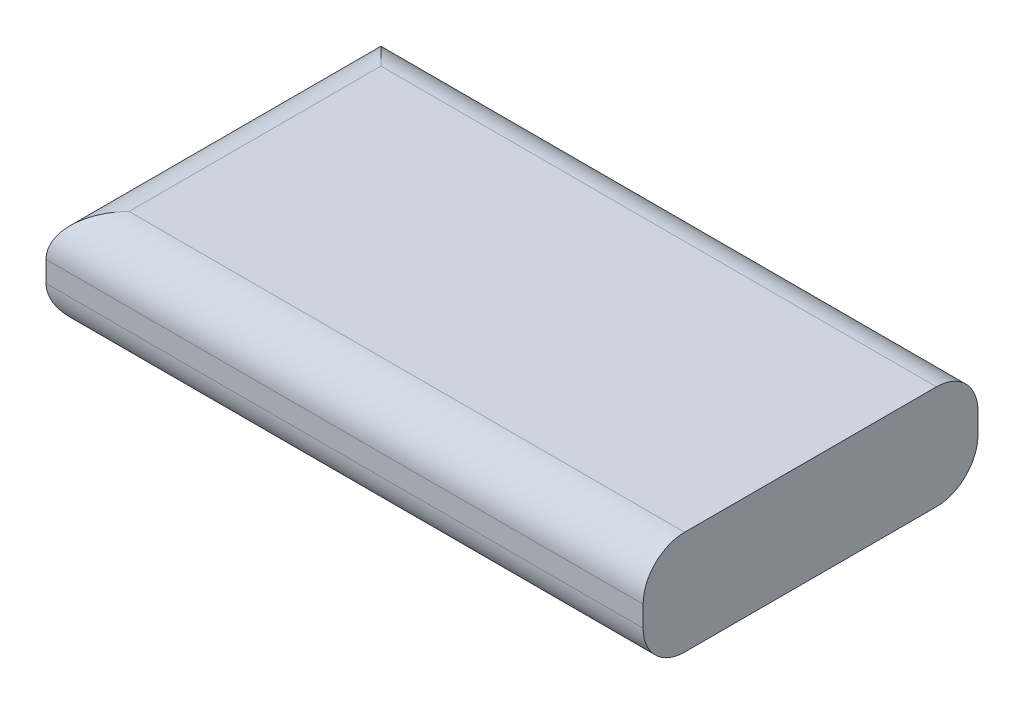
ISO-10303-21;
HEADER;
FILE_DESCRIPTION(('STEP AP214'),'2;1');
FILE_NAME('part.step','',(''),(''),'','','');
FILE_SCHEMA(('AUTOMOTIVE_DESIGN { 1 0 10303 214 1 1 1 1 }'));
ENDSEC;
DATA;
#1=APPLICATION_CONTEXT('core data for automotive mechanical design processes');
#2=APPLICATION_PROTOCOL_DEFINITION('international standard','automotive_design',2000,#1);
#3=PRODUCT_CONTEXT('',#1,'mechanical');
#4=PRODUCT('Part','Part','',(#3));
#5=PRODUCT_RELATED_PRODUCT_CATEGORY('part','',(#4));
#6=PRODUCT_DEFINITION_FORMATION('','',#4);
#7=PRODUCT_DEFINITION_CONTEXT('part definition',#1,'design');
#8=PRODUCT_DEFINITION('design','',#6,#7);
#9=PRODUCT_DEFINITION_SHAPE('','',#8);
#10=(LENGTH_UNIT() NAMED_UNIT(*) SI_UNIT(.MILLI.,.METRE.));
#11=(NAMED_UNIT(*) PLANE_ANGLE_UNIT() SI_UNIT($,.RADIAN.));
#12=(NAMED_UNIT(*) SI_UNIT($,.STERADIAN.) SOLID_ANGLE_UNIT());
#13=UNCERTAINTY_MEASURE_WITH_UNIT(LENGTH_MEASURE(1.E-05),#10,'distance_accuracy_value','');
#14=(GEOMETRIC_REPRESENTATION_CONTEXT(3) GLOBAL_UNCERTAINTY_ASSIGNED_CONTEXT((#13)) GLOBAL_UNIT_ASSIGNED_CONTEXT((#10,
#11,#12)) REPRESENTATION_CONTEXT('',''));
#15=CARTESIAN_POINT('',(0.,0.,0.));
#16=DIRECTION('',(0.,0.,1.));
#17=DIRECTION('',(1.,0.,0.));
#18=AXIS2_PLACEMENT_3D('',#15,#16,#17);
#19=CARTESIAN_POINT('',(-23.,8.,-12.9));
#20=DIRECTION('',(1.,0.,0.));
#21=DIRECTION('',(0.,0.,-1.));
#22=AXIS2_PLACEMENT_3D('',#19,#20,#21);
#23=PLANE('',#22);
#24=DIRECTION('',(0.,-1.,0.));
#25=VECTOR('',#24,1.);
#26=CARTESIAN_POINT('',(-23.,8.,-12.9));
#27=LINE('',#26,#25);
#28=CARTESIAN_POINT('',(-23.,4.8,-12.9));
#29=VERTEX_POINT('',#28);
#30=CARTESIAN_POINT('',(-23.,3.2,-12.9));
#31=VERTEX_POINT('',#30);
#32=EDGE_CURVE('E188',#29,#31,#27,.T.);
#33=ORIENTED_EDGE('',*,*,#32,.T.);
#34=DIRECTION('',(0.,0.,1.));
#35=VECTOR('',#34,1.);
#36=CARTESIAN_POINT('',(-23.,3.2,-12.9));
#37=LINE('',#36,#35);
#38=CARTESIAN_POINT('',(-23.,3.2,12.9));
#39=VERTEX_POINT('',#38);
#40=EDGE_CURVE('E121',#31,#39,#37,.T.);
#41=ORIENTED_EDGE('',*,*,#40,.T.);
#42=DIRECTION('',(0.,-1.,0.));
#43=VECTOR('',#42,1.);
#44=CARTESIAN_POINT('',(-23.,8.,12.9));
#45=LINE('',#44,#43);
#46=CARTESIAN_POINT('',(-23.,4.8,12.9));
#47=VERTEX_POINT('',#46);
#48=EDGE_CURVE('E107',#47,#39,#45,.T.);
#49=ORIENTED_EDGE('',*,*,#48,.F.);
#50=DIRECTION('',(0.,0.,1.));
#51=VECTOR('',#50,1.);
#52=CARTESIAN_POINT('',(-23.,4.8,-12.9));
#53=LINE('',#52,#51);
#54=EDGE_CURVE('E118',#47,#29,#53,.F.);
#55=ORIENTED_EDGE('',*,*,#54,.T.);
#56=EDGE_LOOP('',(#33,#41,#49,#55));
#57=FACE_BOUND('',#56,.T.);
#58=ADVANCED_FACE('F39',(#57),#23,.F.);
#59=CARTESIAN_POINT('',(-23.,8.,12.9));
#60=DIRECTION('',(0.,0.,-1.));
#61=DIRECTION('',(-1.,0.,0.));
#62=AXIS2_PLACEMENT_3D('',#59,#60,#61);
#63=PLANE('',#62);
#64=ORIENTED_EDGE('',*,*,#48,.T.);
#65=DIRECTION('',(1.,0.,0.));
#66=VECTOR('',#65,1.);
#67=CARTESIAN_POINT('',(-23.,3.2,12.9));
#68=LINE('',#67,#66);
#69=CARTESIAN_POINT('',(23.,3.2,12.9));
#70=VERTEX_POINT('',#69);
#71=EDGE_CURVE('E11',#39,#70,#68,.T.);
#72=ORIENTED_EDGE('',*,*,#71,.T.);
#73=DIRECTION('',(0.,-1.,0.));
#74=VECTOR('',#73,1.);
#75=CARTESIAN_POINT('',(23.,8.,12.9));
#76=LINE('',#75,#74);
#77=CARTESIAN_POINT('',(23.,4.8,12.9));
#78=VERTEX_POINT('',#77);
#79=EDGE_CURVE('E108',#78,#70,#76,.T.);
#80=ORIENTED_EDGE('',*,*,#79,.F.);
#81=DIRECTION('',(1.,0.,0.));
#82=VECTOR('',#81,1.);
#83=CARTESIAN_POINT('',(-23.,4.8,12.9));
#84=LINE('',#83,#82);
#85=EDGE_CURVE('E49',#78,#47,#84,.F.);
#86=ORIENTED_EDGE('',*,*,#85,.T.);
#87=EDGE_LOOP('',(#64,#72,#80,#86));
#88=FACE_BOUND('',#87,.T.);
#89=ADVANCED_FACE('F106',(#88),#63,.F.);
#90=CARTESIAN_POINT('',(23.,8.,-12.9));
#91=DIRECTION('',(1.,0.,0.));
#92=DIRECTION('',(0.,0.,-1.));
#93=AXIS2_PLACEMENT_3D('',#90,#91,#92);
#94=PLANE('',#93);
#95=DIRECTION('',(0.,0.,1.));
#96=VECTOR('',#95,1.);
#97=CARTESIAN_POINT('',(23.,0.,-12.9));
#98=LINE('',#97,#96);
#99=CARTESIAN_POINT('',(23.,0.,-9.7));
#100=VERTEX_POINT('',#99);
#101=CARTESIAN_POINT('',(23.,0.,9.7));
#102=VERTEX_POINT('',#101);
#103=EDGE_CURVE('E144',#100,#102,#98,.T.);
#104=ORIENTED_EDGE('',*,*,#103,.F.);
#105=CARTESIAN_POINT('',(23.,3.2,-9.7));
#106=DIRECTION('',(1.,0.,0.));
#107=DIRECTION('',(0.,0.,-1.));
#108=AXIS2_PLACEMENT_3D('',#105,#106,#107);
#109=CIRCLE('',#108,3.2);
#110=CARTESIAN_POINT('',(23.,3.2,-12.9));
#111=VERTEX_POINT('',#110);
#112=EDGE_CURVE('E152',#100,#111,#109,.T.);
#113=ORIENTED_EDGE('',*,*,#112,.T.);
#114=DIRECTION('',(0.,-1.,0.));
#115=VECTOR('',#114,1.);
#116=CARTESIAN_POINT('',(23.,8.,-12.9));
#117=LINE('',#116,#115);
#118=CARTESIAN_POINT('',(23.,4.8,-12.9));
#119=VERTEX_POINT('',#118);
#120=EDGE_CURVE('E184',#119,#111,#117,.T.);
#121=ORIENTED_EDGE('',*,*,#120,.F.);
#122=CARTESIAN_POINT('',(23.,4.8,-9.7));
#123=DIRECTION('',(1.,0.,0.));
#124=DIRECTION('',(0.,0.,-1.));
#125=AXIS2_PLACEMENT_3D('',#122,#123,#124);
#126=CIRCLE('',#125,3.2);
#127=CARTESIAN_POINT('',(23.,8.,-9.7));
#128=VERTEX_POINT('',#127);
#129=EDGE_CURVE('E155',#119,#128,#126,.T.);
#130=ORIENTED_EDGE('',*,*,#129,.T.);
#131=DIRECTION('',(0.,0.,1.));
#132=VECTOR('',#131,1.);
#133=CARTESIAN_POINT('',(23.,8.,-12.9));
#134=LINE('',#133,#132);
#135=CARTESIAN_POINT('',(23.,8.,9.7));
#136=VERTEX_POINT('',#135);
#137=EDGE_CURVE('E191',#128,#136,#134,.T.);
#138=ORIENTED_EDGE('',*,*,#137,.T.);
#139=CARTESIAN_POINT('',(23.,4.8,9.7));
#140=DIRECTION('',(1.,0.,0.));
#141=DIRECTION('',(0.,0.,-1.));
#142=AXIS2_PLACEMENT_3D('',#139,#140,#141);
#143=CIRCLE('',#142,3.2);
#144=EDGE_CURVE('E62',#136,#78,#143,.T.);
#145=ORIENTED_EDGE('',*,*,#144,.T.);
#146=ORIENTED_EDGE('',*,*,#79,.T.);
#147=CARTESIAN_POINT('',(23.,3.2,9.7));
#148=DIRECTION('',(1.,0.,0.));
#149=DIRECTION('',(0.,0.,-1.));
#150=AXIS2_PLACEMENT_3D('',#147,#148,#149);
#151=CIRCLE('',#150,3.2);
#152=EDGE_CURVE('E158',#70,#102,#151,.T.);
#153=ORIENTED_EDGE('',*,*,#152,.T.);
#154=EDGE_LOOP('',(#104,#113,#121,#130,#138,#145,#146,#153));
#155=FACE_BOUND('',#154,.T.);
#156=ADVANCED_FACE('F198',(#155),#94,.T.);
#157=CARTESIAN_POINT('',(-23.,8.,-12.9));
#158=DIRECTION('',(0.,0.,-1.));
#159=DIRECTION('',(-1.,0.,0.));
#160=AXIS2_PLACEMENT_3D('',#157,#158,#159);
#161=PLANE('',#160);
#162=ORIENTED_EDGE('',*,*,#120,.T.);
#163=DIRECTION('',(1.,0.,0.));
#164=VECTOR('',#163,1.);
#165=CARTESIAN_POINT('',(-23.,3.2,-12.9));
#166=LINE('',#165,#164);
#167=EDGE_CURVE('E112',#111,#31,#166,.F.);
#168=ORIENTED_EDGE('',*,*,#167,.T.);
#169=ORIENTED_EDGE('',*,*,#32,.F.);
#170=DIRECTION('',(1.,0.,0.));
#171=VECTOR('',#170,1.);
#172=CARTESIAN_POINT('',(-23.,4.8,-12.9));
#173=LINE('',#172,#171);
#174=EDGE_CURVE('E149',#29,#119,#173,.T.);
#175=ORIENTED_EDGE('',*,*,#174,.T.);
#176=EDGE_LOOP('',(#162,#168,#169,#175));
#177=FACE_BOUND('',#176,.T.);
#178=ADVANCED_FACE('F207',(#177),#161,.T.);
#179=CARTESIAN_POINT('',(0.,8.,0.));
#180=DIRECTION('',(0.,1.,0.));
#181=DIRECTION('',(0.,0.,1.));
#182=AXIS2_PLACEMENT_3D('',#179,#180,#181);
#183=PLANE('',#182);
#184=ORIENTED_EDGE('',*,*,#137,.F.);
#185=DIRECTION('',(1.,0.,0.));
#186=VECTOR('',#185,1.);
#187=CARTESIAN_POINT('',(0.,8.,-9.7));
#188=LINE('',#187,#186);
#189=CARTESIAN_POINT('',(-19.8,8.,-9.7));
#190=VERTEX_POINT('',#189);
#191=EDGE_CURVE('E163',#128,#190,#188,.F.);
#192=ORIENTED_EDGE('',*,*,#191,.T.);
#193=DIRECTION('',(0.,0.,1.));
#194=VECTOR('',#193,1.);
#195=CARTESIAN_POINT('',(-19.8,8.,12.9));
#196=LINE('',#195,#194);
#197=CARTESIAN_POINT('',(-19.8,8.,9.7));
#198=VERTEX_POINT('',#197);
#199=EDGE_CURVE('E166',#190,#198,#196,.T.);
#200=ORIENTED_EDGE('',*,*,#199,.T.);
#201=DIRECTION('',(1.,0.,0.));
#202=VECTOR('',#201,1.);
#203=CARTESIAN_POINT('',(23.,8.,9.7));
#204=LINE('',#203,#202);
#205=EDGE_CURVE('E134',#198,#136,#204,.T.);
#206=ORIENTED_EDGE('',*,*,#205,.T.);
#207=EDGE_LOOP('',(#184,#192,#200,#206));
#208=FACE_BOUND('',#207,.T.);
#209=ADVANCED_FACE('F203',(#208),#183,.T.);
#210=CARTESIAN_POINT('',(0.,0.,0.));
#211=DIRECTION('',(0.,1.,0.));
#212=DIRECTION('',(0.,0.,1.));
#213=AXIS2_PLACEMENT_3D('',#210,#211,#212);
#214=PLANE('',#213);
#215=DIRECTION('',(0.,0.,1.));
#216=VECTOR('',#215,1.);
#217=CARTESIAN_POINT('',(-19.8,0.,0.));
#218=LINE('',#217,#216);
#219=CARTESIAN_POINT('',(-19.8,0.,9.7));
#220=VERTEX_POINT('',#219);
#221=CARTESIAN_POINT('',(-19.8,0.,-9.7));
#222=VERTEX_POINT('',#221);
#223=EDGE_CURVE('E174',#220,#222,#218,.F.);
#224=ORIENTED_EDGE('',*,*,#223,.T.);
#225=DIRECTION('',(1.,0.,0.));
#226=VECTOR('',#225,1.);
#227=CARTESIAN_POINT('',(23.,0.,-9.7));
#228=LINE('',#227,#226);
#229=EDGE_CURVE('E171',#222,#100,#228,.T.);
#230=ORIENTED_EDGE('',*,*,#229,.T.);
#231=ORIENTED_EDGE('',*,*,#103,.T.);
#232=DIRECTION('',(1.,0.,0.));
#233=VECTOR('',#232,1.);
#234=CARTESIAN_POINT('',(0.,0.,9.7));
#235=LINE('',#234,#233);
#236=EDGE_CURVE('E177',#102,#220,#235,.F.);
#237=ORIENTED_EDGE('',*,*,#236,.T.);
#238=EDGE_LOOP('',(#224,#230,#231,#237));
#239=FACE_BOUND('',#238,.T.);
#240=ADVANCED_FACE('F223',(#239),#214,.F.);
#241=CARTESIAN_POINT('',(0.,3.2,-9.7));
#242=DIRECTION('',(-1.,0.,0.));
#243=DIRECTION('',(0.,0.,1.));
#244=AXIS2_PLACEMENT_3D('',#241,#242,#243);
#245=CYLINDRICAL_SURFACE('',#244,3.2);
#246=ORIENTED_EDGE('',*,*,#112,.F.);
#247=ORIENTED_EDGE('',*,*,#229,.F.);
#248=CARTESIAN_POINT('',(-19.8,3.2,-9.7));
#249=DIRECTION('',(-0.707106781186547,0.,0.707106781186547));
#250=DIRECTION('',(-0.707106781186547,0.,-0.707106781186547));
#251=AXIS2_PLACEMENT_3D('',#248,#249,#250);
#252=ELLIPSE('',#251,4.5254833995939,3.2);
#253=EDGE_CURVE('E140',#31,#222,#252,.T.);
#254=ORIENTED_EDGE('',*,*,#253,.F.);
#255=ORIENTED_EDGE('',*,*,#167,.F.);
#256=EDGE_LOOP('',(#246,#247,#254,#255));
#257=FACE_BOUND('',#256,.T.);
#258=ADVANCED_FACE('F212',(#257),#245,.T.);
#259=CARTESIAN_POINT('',(-23.,3.2,9.7));
#260=DIRECTION('',(1.,0.,0.));
#261=DIRECTION('',(0.,0.,-1.));
#262=AXIS2_PLACEMENT_3D('',#259,#260,#261);
#263=CYLINDRICAL_SURFACE('',#262,3.2);
#264=ORIENTED_EDGE('',*,*,#152,.F.);
#265=ORIENTED_EDGE('',*,*,#71,.F.);
#266=CARTESIAN_POINT('',(-19.8,3.2,9.7));
#267=DIRECTION('',(0.707106781186547,0.,0.707106781186547));
#268=DIRECTION('',(0.707106781186547,0.,-0.707106781186547));
#269=AXIS2_PLACEMENT_3D('',#266,#267,#268);
#270=ELLIPSE('',#269,4.5254833995939,3.2);
#271=EDGE_CURVE('E138',#220,#39,#270,.F.);
#272=ORIENTED_EDGE('',*,*,#271,.F.);
#273=ORIENTED_EDGE('',*,*,#236,.F.);
#274=EDGE_LOOP('',(#264,#265,#272,#273));
#275=FACE_BOUND('',#274,.T.);
#276=ADVANCED_FACE('F221',(#275),#263,.T.);
#277=CARTESIAN_POINT('',(-19.8,3.2,-12.9));
#278=DIRECTION('',(0.,0.,1.));
#279=DIRECTION('',(1.,0.,0.));
#280=AXIS2_PLACEMENT_3D('',#277,#278,#279);
#281=CYLINDRICAL_SURFACE('',#280,3.2);
#282=ORIENTED_EDGE('',*,*,#253,.T.);
#283=ORIENTED_EDGE('',*,*,#223,.F.);
#284=ORIENTED_EDGE('',*,*,#271,.T.);
#285=ORIENTED_EDGE('',*,*,#40,.F.);
#286=EDGE_LOOP('',(#282,#283,#284,#285));
#287=FACE_BOUND('',#286,.T.);
#288=ADVANCED_FACE('F216',(#287),#281,.T.);
#289=CARTESIAN_POINT('',(-23.,4.8,-9.7));
#290=DIRECTION('',(1.,0.,0.));
#291=DIRECTION('',(0.,0.,-1.));
#292=AXIS2_PLACEMENT_3D('',#289,#290,#291);
#293=CYLINDRICAL_SURFACE('',#292,3.2);
#294=ORIENTED_EDGE('',*,*,#129,.F.);
#295=ORIENTED_EDGE('',*,*,#174,.F.);
#296=CARTESIAN_POINT('',(-19.8,4.8,-9.7));
#297=DIRECTION('',(0.707106781186547,0.,-0.707106781186547));
#298=DIRECTION('',(0.707106781186547,0.,0.707106781186547));
#299=AXIS2_PLACEMENT_3D('',#296,#297,#298);
#300=ELLIPSE('',#299,4.5254833995939,3.2);
#301=EDGE_CURVE('E43',#190,#29,#300,.F.);
#302=ORIENTED_EDGE('',*,*,#301,.F.);
#303=ORIENTED_EDGE('',*,*,#191,.F.);
#304=EDGE_LOOP('',(#294,#295,#302,#303));
#305=FACE_BOUND('',#304,.T.);
#306=ADVANCED_FACE('F41',(#305),#293,.T.);
#307=CARTESIAN_POINT('',(0.,4.8,9.7));
#308=DIRECTION('',(-1.,0.,0.));
#309=DIRECTION('',(0.,0.,1.));
#310=AXIS2_PLACEMENT_3D('',#307,#308,#309);
#311=CYLINDRICAL_SURFACE('',#310,3.2);
#312=ORIENTED_EDGE('',*,*,#144,.F.);
#313=ORIENTED_EDGE('',*,*,#205,.F.);
#314=CARTESIAN_POINT('',(-19.8,4.8,9.7));
#315=DIRECTION('',(-0.707106781186547,0.,-0.707106781186547));
#316=DIRECTION('',(-0.707106781186547,0.,0.707106781186547));
#317=AXIS2_PLACEMENT_3D('',#314,#315,#316);
#318=ELLIPSE('',#317,4.5254833995939,3.2);
#319=EDGE_CURVE('E128',#47,#198,#318,.T.);
#320=ORIENTED_EDGE('',*,*,#319,.F.);
#321=ORIENTED_EDGE('',*,*,#85,.F.);
#322=EDGE_LOOP('',(#312,#313,#320,#321));
#323=FACE_BOUND('',#322,.T.);
#324=ADVANCED_FACE('F133',(#323),#311,.T.);
#325=CARTESIAN_POINT('',(-19.8,4.8,0.));
#326=DIRECTION('',(0.,0.,-1.));
#327=DIRECTION('',(-1.,0.,0.));
#328=AXIS2_PLACEMENT_3D('',#325,#326,#327);
#329=CYLINDRICAL_SURFACE('',#328,3.2);
#330=ORIENTED_EDGE('',*,*,#301,.T.);
#331=ORIENTED_EDGE('',*,*,#54,.F.);
#332=ORIENTED_EDGE('',*,*,#319,.T.);
#333=ORIENTED_EDGE('',*,*,#199,.F.);
#334=EDGE_LOOP('',(#330,#331,#332,#333));
#335=FACE_BOUND('',#334,.T.);
#336=ADVANCED_FACE('F126',(#335),#329,.T.);
#337=CLOSED_SHELL('',(#58,#89,#156,#178,#209,#240,#258,#276,#288,#306,#324,#336));
#338=MANIFOLD_SOLID_BREP('B2',#337);
#339=ADVANCED_BREP_SHAPE_REPRESENTATION('',(#18,#338),#14);
#340=SHAPE_DEFINITION_REPRESENTATION(#9,#339);
ENDSEC;
END-ISO-10303-21;
